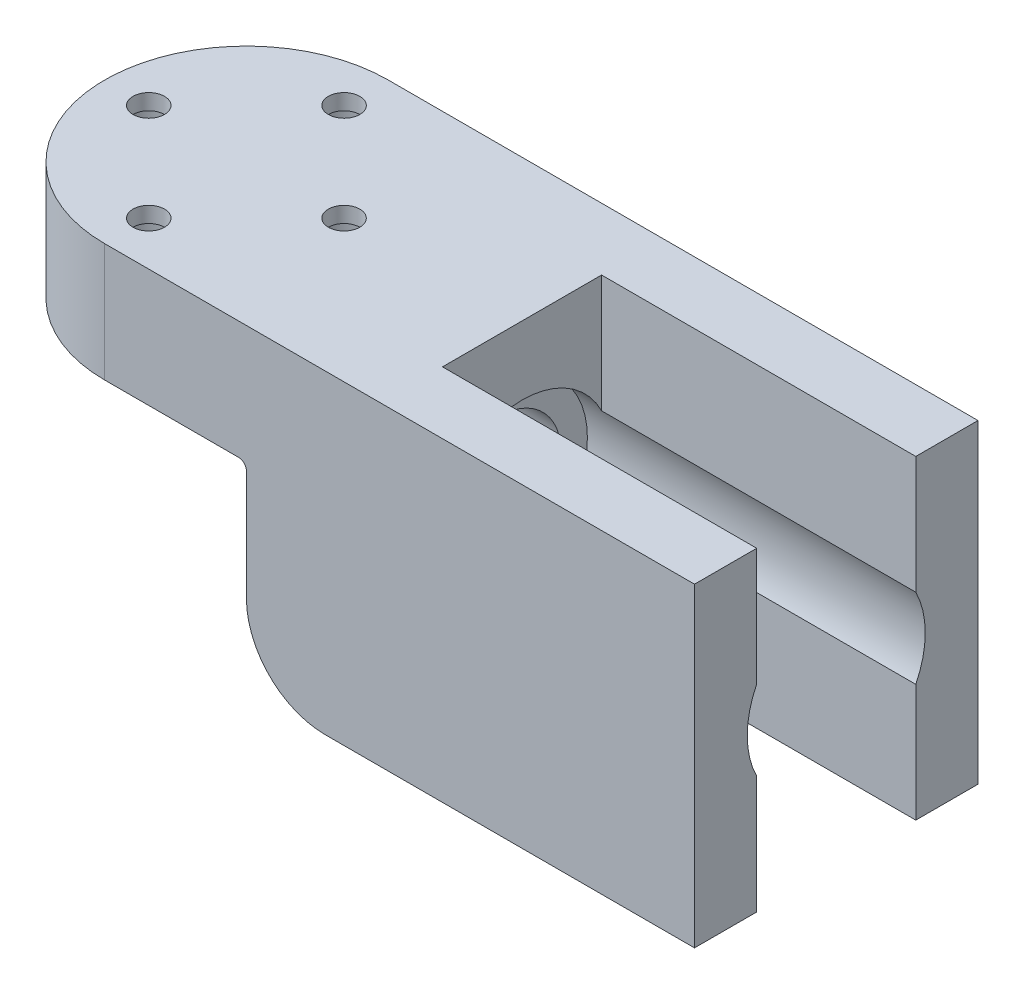
ISO-10303-21;
HEADER;
FILE_DESCRIPTION(('STEP AP214'),'2;1');
FILE_NAME('part.step','',(''),(''),'','','');
FILE_SCHEMA(('AUTOMOTIVE_DESIGN { 1 0 10303 214 1 1 1 1 }'));
ENDSEC;
DATA;
#1=APPLICATION_CONTEXT('core data for automotive mechanical design processes');
#2=APPLICATION_PROTOCOL_DEFINITION('international standard','automotive_design',2000,#1);
#3=PRODUCT_CONTEXT('',#1,'mechanical');
#4=PRODUCT('Part','Part','',(#3));
#5=PRODUCT_RELATED_PRODUCT_CATEGORY('part','',(#4));
#6=PRODUCT_DEFINITION_FORMATION('','',#4);
#7=PRODUCT_DEFINITION_CONTEXT('part definition',#1,'design');
#8=PRODUCT_DEFINITION('design','',#6,#7);
#9=PRODUCT_DEFINITION_SHAPE('','',#8);
#10=(LENGTH_UNIT() NAMED_UNIT(*) SI_UNIT(.MILLI.,.METRE.));
#11=(NAMED_UNIT(*) PLANE_ANGLE_UNIT() SI_UNIT($,.RADIAN.));
#12=(NAMED_UNIT(*) SI_UNIT($,.STERADIAN.) SOLID_ANGLE_UNIT());
#13=UNCERTAINTY_MEASURE_WITH_UNIT(LENGTH_MEASURE(1.E-05),#10,'distance_accuracy_value','');
#14=(GEOMETRIC_REPRESENTATION_CONTEXT(3) GLOBAL_UNCERTAINTY_ASSIGNED_CONTEXT((#13)) GLOBAL_UNIT_ASSIGNED_CONTEXT((#10,
#11,#12)) REPRESENTATION_CONTEXT('',''));
#15=CARTESIAN_POINT('',(0.,0.,0.));
#16=DIRECTION('',(0.,0.,1.));
#17=DIRECTION('',(1.,0.,0.));
#18=AXIS2_PLACEMENT_3D('',#15,#16,#17);
#19=CARTESIAN_POINT('',(0.,20.,0.));
#20=DIRECTION('',(0.,-1.,0.));
#21=DIRECTION('',(0.,0.,-1.));
#22=AXIS2_PLACEMENT_3D('',#19,#20,#21);
#23=CYLINDRICAL_SURFACE('',#22,9.);
#24=CARTESIAN_POINT('',(0.,12.5,0.));
#25=DIRECTION('',(0.,-1.,0.));
#26=DIRECTION('',(0.,0.,-1.));
#27=AXIS2_PLACEMENT_3D('',#24,#25,#26);
#28=CIRCLE('',#27,9.);
#29=CARTESIAN_POINT('',(0.,12.5,9.));
#30=VERTEX_POINT('',#29);
#31=CARTESIAN_POINT('',(0.,12.5,-9.));
#32=VERTEX_POINT('',#31);
#33=EDGE_CURVE('E171',#30,#32,#28,.T.);
#34=ORIENTED_EDGE('',*,*,#33,.F.);
#35=DIRECTION('',(0.,-1.,0.));
#36=VECTOR('',#35,1.);
#37=CARTESIAN_POINT('',(0.,20.,9.));
#38=LINE('',#37,#36);
#39=CARTESIAN_POINT('',(0.,20.,9.));
#40=VERTEX_POINT('',#39);
#41=EDGE_CURVE('E180',#40,#30,#38,.T.);
#42=ORIENTED_EDGE('',*,*,#41,.F.);
#43=CARTESIAN_POINT('',(0.,20.,0.));
#44=DIRECTION('',(0.,1.,0.));
#45=DIRECTION('',(0.,0.,1.));
#46=AXIS2_PLACEMENT_3D('',#43,#44,#45);
#47=CIRCLE('',#46,9.);
#48=CARTESIAN_POINT('',(0.,20.,-9.));
#49=VERTEX_POINT('',#48);
#50=EDGE_CURVE('E236',#49,#40,#47,.T.);
#51=ORIENTED_EDGE('',*,*,#50,.F.);
#52=DIRECTION('',(0.,-1.,0.));
#53=VECTOR('',#52,1.);
#54=CARTESIAN_POINT('',(0.,20.,-9.));
#55=LINE('',#54,#53);
#56=EDGE_CURVE('E183',#49,#32,#55,.T.);
#57=ORIENTED_EDGE('',*,*,#56,.T.);
#58=EDGE_LOOP('',(#34,#42,#51,#57));
#59=FACE_BOUND('',#58,.T.);
#60=ADVANCED_FACE('F35',(#59),#23,.T.);
#61=CARTESIAN_POINT('',(0.,25.5154328932551,6.2));
#62=DIRECTION('',(0.,-1.,0.));
#63=DIRECTION('',(0.,0.,-1.));
#64=AXIS2_PLACEMENT_3D('',#61,#62,#63);
#65=CYLINDRICAL_SURFACE('',#64,1.95);
#66=CARTESIAN_POINT('',(0.,19.,6.2));
#67=DIRECTION('',(0.,1.,0.));
#68=DIRECTION('',(0.,0.,1.));
#69=AXIS2_PLACEMENT_3D('',#66,#67,#68);
#70=CIRCLE('',#69,1.95);
#71=CARTESIAN_POINT('',(0.,19.,8.15));
#72=VERTEX_POINT('',#71);
#73=EDGE_CURVE('E227',#72,#72,#70,.F.);
#74=ORIENTED_EDGE('',*,*,#73,.F.);
#75=EDGE_LOOP('',(#74));
#76=FACE_BOUND('',#75,.T.);
#77=CARTESIAN_POINT('',(0.,12.5,6.2));
#78=DIRECTION('',(0.,-1.,0.));
#79=DIRECTION('',(0.,0.,-1.));
#80=AXIS2_PLACEMENT_3D('',#77,#78,#79);
#81=CIRCLE('',#80,1.95);
#82=CARTESIAN_POINT('',(0.,12.5,4.25));
#83=VERTEX_POINT('',#82);
#84=EDGE_CURVE('E684',#83,#83,#81,.F.);
#85=ORIENTED_EDGE('',*,*,#84,.F.);
#86=EDGE_LOOP('',(#85));
#87=FACE_BOUND('',#86,.T.);
#88=ADVANCED_FACE('F301',(#76,#87),#65,.F.);
#89=CARTESIAN_POINT('',(0.,25.5154328932551,-6.2));
#90=DIRECTION('',(0.,-1.,0.));
#91=DIRECTION('',(0.,0.,-1.));
#92=AXIS2_PLACEMENT_3D('',#89,#90,#91);
#93=CYLINDRICAL_SURFACE('',#92,1.95);
#94=CARTESIAN_POINT('',(0.,19.,-6.2));
#95=DIRECTION('',(0.,1.,0.));
#96=DIRECTION('',(0.,0.,1.));
#97=AXIS2_PLACEMENT_3D('',#94,#95,#96);
#98=CIRCLE('',#97,1.95);
#99=CARTESIAN_POINT('',(0.,19.,-4.25));
#100=VERTEX_POINT('',#99);
#101=EDGE_CURVE('E231',#100,#100,#98,.F.);
#102=ORIENTED_EDGE('',*,*,#101,.F.);
#103=EDGE_LOOP('',(#102));
#104=FACE_BOUND('',#103,.T.);
#105=CARTESIAN_POINT('',(0.,12.5,-6.2));
#106=DIRECTION('',(0.,-1.,0.));
#107=DIRECTION('',(0.,0.,-1.));
#108=AXIS2_PLACEMENT_3D('',#105,#106,#107);
#109=CIRCLE('',#108,1.95);
#110=CARTESIAN_POINT('',(0.,12.5,-8.15));
#111=VERTEX_POINT('',#110);
#112=EDGE_CURVE('E687',#111,#111,#109,.F.);
#113=ORIENTED_EDGE('',*,*,#112,.F.);
#114=EDGE_LOOP('',(#113));
#115=FACE_BOUND('',#114,.T.);
#116=ADVANCED_FACE('F318',(#104,#115),#93,.F.);
#117=CARTESIAN_POINT('',(-6.2,25.5154328932551,0.));
#118=DIRECTION('',(0.,-1.,0.));
#119=DIRECTION('',(0.,0.,-1.));
#120=AXIS2_PLACEMENT_3D('',#117,#118,#119);
#121=CYLINDRICAL_SURFACE('',#120,1.95);
#122=CARTESIAN_POINT('',(-6.2,19.,0.));
#123=DIRECTION('',(0.,1.,0.));
#124=DIRECTION('',(0.,0.,1.));
#125=AXIS2_PLACEMENT_3D('',#122,#123,#124);
#126=CIRCLE('',#125,1.95);
#127=CARTESIAN_POINT('',(-6.2,19.,1.95));
#128=VERTEX_POINT('',#127);
#129=EDGE_CURVE('E228',#128,#128,#126,.F.);
#130=ORIENTED_EDGE('',*,*,#129,.F.);
#131=EDGE_LOOP('',(#130));
#132=FACE_BOUND('',#131,.T.);
#133=CARTESIAN_POINT('',(-6.2,12.5,0.));
#134=DIRECTION('',(0.,-1.,0.));
#135=DIRECTION('',(0.,0.,-1.));
#136=AXIS2_PLACEMENT_3D('',#133,#134,#135);
#137=CIRCLE('',#136,1.95);
#138=CARTESIAN_POINT('',(-6.2,12.5,-1.95));
#139=VERTEX_POINT('',#138);
#140=EDGE_CURVE('E690',#139,#139,#137,.F.);
#141=ORIENTED_EDGE('',*,*,#140,.F.);
#142=EDGE_LOOP('',(#141));
#143=FACE_BOUND('',#142,.T.);
#144=ADVANCED_FACE('F326',(#132,#143),#121,.F.);
#145=CARTESIAN_POINT('',(6.2,25.5154328932551,0.));
#146=DIRECTION('',(0.,-1.,0.));
#147=DIRECTION('',(0.,0.,-1.));
#148=AXIS2_PLACEMENT_3D('',#145,#146,#147);
#149=CYLINDRICAL_SURFACE('',#148,1.95);
#150=CARTESIAN_POINT('',(6.2,19.,0.));
#151=DIRECTION('',(0.,1.,0.));
#152=DIRECTION('',(0.,0.,1.));
#153=AXIS2_PLACEMENT_3D('',#150,#151,#152);
#154=CIRCLE('',#153,1.95);
#155=CARTESIAN_POINT('',(6.2,19.,1.95));
#156=VERTEX_POINT('',#155);
#157=EDGE_CURVE('E224',#156,#156,#154,.F.);
#158=ORIENTED_EDGE('',*,*,#157,.F.);
#159=EDGE_LOOP('',(#158));
#160=FACE_BOUND('',#159,.T.);
#161=CARTESIAN_POINT('',(6.2,12.5,0.));
#162=DIRECTION('',(0.,-1.,0.));
#163=DIRECTION('',(0.,0.,-1.));
#164=AXIS2_PLACEMENT_3D('',#161,#162,#163);
#165=CIRCLE('',#164,1.95);
#166=CARTESIAN_POINT('',(6.2,12.5,-1.95));
#167=VERTEX_POINT('',#166);
#168=EDGE_CURVE('E693',#167,#167,#165,.F.);
#169=ORIENTED_EDGE('',*,*,#168,.F.);
#170=EDGE_LOOP('',(#169));
#171=FACE_BOUND('',#170,.T.);
#172=ADVANCED_FACE('F334',(#160,#171),#149,.F.);
#173=CARTESIAN_POINT('',(17.5,20.,-5.05000000000001));
#174=DIRECTION('',(-1.,0.,0.));
#175=DIRECTION('',(0.,0.,1.));
#176=AXIS2_PLACEMENT_3D('',#173,#174,#175);
#177=PLANE('',#176);
#178=CARTESIAN_POINT('',(17.5,10.,0.));
#179=DIRECTION('',(-1.,0.,0.));
#180=DIRECTION('',(0.,0.,1.));
#181=AXIS2_PLACEMENT_3D('',#178,#179,#180);
#182=CIRCLE('',#181,5.65);
#183=CARTESIAN_POINT('',(17.5,7.46622810813604,5.05000000000001));
#184=VERTEX_POINT('',#183);
#185=CARTESIAN_POINT('',(17.5,7.46622810813602,-5.05000000000001));
#186=VERTEX_POINT('',#185);
#187=EDGE_CURVE('E677',#184,#186,#182,.F.);
#188=ORIENTED_EDGE('',*,*,#187,.F.);
#189=DIRECTION('',(0.,-1.,0.));
#190=VECTOR('',#189,1.);
#191=CARTESIAN_POINT('',(17.5,20.,5.05));
#192=LINE('',#191,#190);
#193=CARTESIAN_POINT('',(17.5,0.,5.05));
#194=VERTEX_POINT('',#193);
#195=EDGE_CURVE('E627',#184,#194,#192,.T.);
#196=ORIENTED_EDGE('',*,*,#195,.T.);
#197=DIRECTION('',(0.,0.,-1.));
#198=VECTOR('',#197,1.);
#199=CARTESIAN_POINT('',(17.5,0.,-5.05000000000001));
#200=LINE('',#199,#198);
#201=CARTESIAN_POINT('',(17.5,0.,-5.05000000000001));
#202=VERTEX_POINT('',#201);
#203=EDGE_CURVE('E655',#194,#202,#200,.T.);
#204=ORIENTED_EDGE('',*,*,#203,.T.);
#205=DIRECTION('',(0.,-1.,0.));
#206=VECTOR('',#205,1.);
#207=CARTESIAN_POINT('',(17.5,20.,-5.05000000000001));
#208=LINE('',#207,#206);
#209=EDGE_CURVE('E205',#186,#202,#208,.T.);
#210=ORIENTED_EDGE('',*,*,#209,.F.);
#211=EDGE_LOOP('',(#188,#196,#204,#210));
#212=FACE_BOUND('',#211,.T.);
#213=ADVANCED_FACE('F342',(#212),#177,.F.);
#214=CARTESIAN_POINT('',(17.5,20.,-5.05000000000001));
#215=DIRECTION('',(0.,0.,-1.));
#216=DIRECTION('',(-1.,0.,0.));
#217=AXIS2_PLACEMENT_3D('',#214,#215,#216);
#218=PLANE('',#217);
#219=DIRECTION('',(-1.,0.,0.));
#220=VECTOR('',#219,1.);
#221=CARTESIAN_POINT('',(37.4496644219723,7.46622810813599,-5.05));
#222=LINE('',#221,#220);
#223=CARTESIAN_POINT('',(37.4496644219723,7.46622810813599,-5.05));
#224=VERTEX_POINT('',#223);
#225=EDGE_CURVE('E675',#186,#224,#222,.F.);
#226=ORIENTED_EDGE('',*,*,#225,.F.);
#227=ORIENTED_EDGE('',*,*,#209,.T.);
#228=DIRECTION('',(1.,0.,0.));
#229=VECTOR('',#228,1.);
#230=CARTESIAN_POINT('',(17.5,0.,-5.05000000000001));
#231=LINE('',#230,#229);
#232=CARTESIAN_POINT('',(37.4496644219723,0.,-5.05));
#233=VERTEX_POINT('',#232);
#234=EDGE_CURVE('E652',#202,#233,#231,.T.);
#235=ORIENTED_EDGE('',*,*,#234,.T.);
#236=DIRECTION('',(0.,-1.,0.));
#237=VECTOR('',#236,1.);
#238=CARTESIAN_POINT('',(37.4496644219723,20.,-5.05));
#239=LINE('',#238,#237);
#240=EDGE_CURVE('E201',#224,#233,#239,.T.);
#241=ORIENTED_EDGE('',*,*,#240,.F.);
#242=EDGE_LOOP('',(#226,#227,#235,#241));
#243=FACE_BOUND('',#242,.T.);
#244=ADVANCED_FACE('F364',(#243),#218,.F.);
#245=DIRECTION('',(-1.,0.,0.));
#246=VECTOR('',#245,1.);
#247=CARTESIAN_POINT('',(37.4496644219723,12.533771891864,-5.05));
#248=LINE('',#247,#246);
#249=CARTESIAN_POINT('',(37.4496644219723,12.533771891864,-5.05));
#250=VERTEX_POINT('',#249);
#251=CARTESIAN_POINT('',(17.5,12.533771891864,-5.05000000000001));
#252=VERTEX_POINT('',#251);
#253=EDGE_CURVE('E658',#250,#252,#248,.T.);
#254=ORIENTED_EDGE('',*,*,#253,.F.);
#255=CARTESIAN_POINT('',(37.4496644219723,20.,-5.05));
#256=VERTEX_POINT('',#255);
#257=EDGE_CURVE('E202',#256,#250,#239,.T.);
#258=ORIENTED_EDGE('',*,*,#257,.F.);
#259=DIRECTION('',(1.,0.,0.));
#260=VECTOR('',#259,1.);
#261=CARTESIAN_POINT('',(17.5,20.,-5.05000000000001));
#262=LINE('',#261,#260);
#263=CARTESIAN_POINT('',(17.5,20.,-5.05000000000001));
#264=VERTEX_POINT('',#263);
#265=EDGE_CURVE('E669',#264,#256,#262,.T.);
#266=ORIENTED_EDGE('',*,*,#265,.F.);
#267=EDGE_CURVE('E206',#264,#252,#208,.T.);
#268=ORIENTED_EDGE('',*,*,#267,.T.);
#269=EDGE_LOOP('',(#254,#258,#266,#268));
#270=FACE_BOUND('',#269,.T.);
#271=ADVANCED_FACE('F367',(#270),#218,.F.);
#272=CARTESIAN_POINT('',(17.5,20.,5.05));
#273=DIRECTION('',(0.,0.,1.));
#274=DIRECTION('',(1.,0.,0.));
#275=AXIS2_PLACEMENT_3D('',#272,#273,#274);
#276=PLANE('',#275);
#277=DIRECTION('',(-1.,0.,0.));
#278=VECTOR('',#277,1.);
#279=CARTESIAN_POINT('',(37.4496644219723,12.533771891864,5.05));
#280=LINE('',#279,#278);
#281=CARTESIAN_POINT('',(17.5,12.533771891864,5.05000000000001));
#282=VERTEX_POINT('',#281);
#283=CARTESIAN_POINT('',(37.4496644219723,12.533771891864,5.05));
#284=VERTEX_POINT('',#283);
#285=EDGE_CURVE('E249',#282,#284,#280,.F.);
#286=ORIENTED_EDGE('',*,*,#285,.F.);
#287=CARTESIAN_POINT('',(17.5,20.,5.05));
#288=VERTEX_POINT('',#287);
#289=EDGE_CURVE('E637',#288,#282,#192,.T.);
#290=ORIENTED_EDGE('',*,*,#289,.F.);
#291=DIRECTION('',(-1.,0.,0.));
#292=VECTOR('',#291,1.);
#293=CARTESIAN_POINT('',(17.5,20.,5.05));
#294=LINE('',#293,#292);
#295=CARTESIAN_POINT('',(37.4496644219723,20.,5.05));
#296=VERTEX_POINT('',#295);
#297=EDGE_CURVE('E659',#296,#288,#294,.T.);
#298=ORIENTED_EDGE('',*,*,#297,.F.);
#299=DIRECTION('',(0.,-1.,0.));
#300=VECTOR('',#299,1.);
#301=CARTESIAN_POINT('',(37.4496644219723,20.,5.05));
#302=LINE('',#301,#300);
#303=EDGE_CURVE('E195',#296,#284,#302,.T.);
#304=ORIENTED_EDGE('',*,*,#303,.T.);
#305=EDGE_LOOP('',(#286,#290,#298,#304));
#306=FACE_BOUND('',#305,.T.);
#307=ADVANCED_FACE('F383',(#306),#276,.F.);
#308=DIRECTION('',(-1.,0.,0.));
#309=VECTOR('',#308,1.);
#310=CARTESIAN_POINT('',(37.4496644219723,7.46622810813604,5.05));
#311=LINE('',#310,#309);
#312=CARTESIAN_POINT('',(37.4496644219723,7.46622810813604,5.05));
#313=VERTEX_POINT('',#312);
#314=EDGE_CURVE('E238',#313,#184,#311,.T.);
#315=ORIENTED_EDGE('',*,*,#314,.F.);
#316=CARTESIAN_POINT('',(37.4496644219723,0.,5.05));
#317=VERTEX_POINT('',#316);
#318=EDGE_CURVE('E625',#313,#317,#302,.T.);
#319=ORIENTED_EDGE('',*,*,#318,.T.);
#320=DIRECTION('',(-1.,0.,0.));
#321=VECTOR('',#320,1.);
#322=CARTESIAN_POINT('',(17.5,0.,5.05));
#323=LINE('',#322,#321);
#324=EDGE_CURVE('E641',#317,#194,#323,.T.);
#325=ORIENTED_EDGE('',*,*,#324,.T.);
#326=ORIENTED_EDGE('',*,*,#195,.F.);
#327=EDGE_LOOP('',(#315,#319,#325,#326));
#328=FACE_BOUND('',#327,.T.);
#329=ADVANCED_FACE('F310',(#328),#276,.F.);
#330=CARTESIAN_POINT('',(0.,20.,0.));
#331=DIRECTION('',(0.,1.,0.));
#332=DIRECTION('',(0.,0.,1.));
#333=AXIS2_PLACEMENT_3D('',#330,#331,#332);
#334=PLANE('',#333);
#335=CARTESIAN_POINT('',(0.,20.,6.2));
#336=DIRECTION('',(0.,-1.,0.));
#337=DIRECTION('',(0.,0.,-1.));
#338=AXIS2_PLACEMENT_3D('',#335,#336,#337);
#339=CIRCLE('',#338,1.);
#340=CARTESIAN_POINT('',(0.,20.,5.2));
#341=VERTEX_POINT('',#340);
#342=EDGE_CURVE('E210',#341,#341,#339,.T.);
#343=ORIENTED_EDGE('',*,*,#342,.T.);
#344=EDGE_LOOP('',(#343));
#345=FACE_BOUND('',#344,.T.);
#346=CARTESIAN_POINT('',(0.,20.,-6.2));
#347=DIRECTION('',(0.,-1.,0.));
#348=DIRECTION('',(0.,0.,-1.));
#349=AXIS2_PLACEMENT_3D('',#346,#347,#348);
#350=CIRCLE('',#349,1.);
#351=CARTESIAN_POINT('',(0.,20.,-7.2));
#352=VERTEX_POINT('',#351);
#353=EDGE_CURVE('E214',#352,#352,#350,.T.);
#354=ORIENTED_EDGE('',*,*,#353,.T.);
#355=EDGE_LOOP('',(#354));
#356=FACE_BOUND('',#355,.T.);
#357=CARTESIAN_POINT('',(-6.2,20.,0.));
#358=DIRECTION('',(0.,-1.,0.));
#359=DIRECTION('',(0.,0.,-1.));
#360=AXIS2_PLACEMENT_3D('',#357,#358,#359);
#361=CIRCLE('',#360,1.);
#362=CARTESIAN_POINT('',(-6.2,20.,-1.));
#363=VERTEX_POINT('',#362);
#364=EDGE_CURVE('E209',#363,#363,#361,.T.);
#365=ORIENTED_EDGE('',*,*,#364,.T.);
#366=EDGE_LOOP('',(#365));
#367=FACE_BOUND('',#366,.T.);
#368=CARTESIAN_POINT('',(6.2,20.,0.));
#369=DIRECTION('',(0.,-1.,0.));
#370=DIRECTION('',(0.,0.,-1.));
#371=AXIS2_PLACEMENT_3D('',#368,#369,#370);
#372=CIRCLE('',#371,1.);
#373=CARTESIAN_POINT('',(6.2,20.,-1.));
#374=VERTEX_POINT('',#373);
#375=EDGE_CURVE('E219',#374,#374,#372,.T.);
#376=ORIENTED_EDGE('',*,*,#375,.T.);
#377=EDGE_LOOP('',(#376));
#378=FACE_BOUND('',#377,.T.);
#379=ORIENTED_EDGE('',*,*,#50,.T.);
#380=DIRECTION('',(1.,0.,0.));
#381=VECTOR('',#380,1.);
#382=CARTESIAN_POINT('',(0.,20.,9.));
#383=LINE('',#382,#381);
#384=CARTESIAN_POINT('',(37.4496644219723,20.,9.));
#385=VERTEX_POINT('',#384);
#386=EDGE_CURVE('E189',#40,#385,#383,.T.);
#387=ORIENTED_EDGE('',*,*,#386,.T.);
#388=DIRECTION('',(0.,0.,-1.));
#389=VECTOR('',#388,1.);
#390=CARTESIAN_POINT('',(37.4496644219723,20.,9.));
#391=LINE('',#390,#389);
#392=EDGE_CURVE('E661',#385,#296,#391,.T.);
#393=ORIENTED_EDGE('',*,*,#392,.T.);
#394=ORIENTED_EDGE('',*,*,#297,.T.);
#395=DIRECTION('',(0.,0.,-1.));
#396=VECTOR('',#395,1.);
#397=CARTESIAN_POINT('',(17.5,20.,-5.05000000000001));
#398=LINE('',#397,#396);
#399=EDGE_CURVE('E643',#288,#264,#398,.T.);
#400=ORIENTED_EDGE('',*,*,#399,.T.);
#401=ORIENTED_EDGE('',*,*,#265,.T.);
#402=DIRECTION('',(0.,0.,-1.));
#403=VECTOR('',#402,1.);
#404=CARTESIAN_POINT('',(37.4496644219723,20.,-9.));
#405=LINE('',#404,#403);
#406=CARTESIAN_POINT('',(37.4496644219723,20.,-9.));
#407=VERTEX_POINT('',#406);
#408=EDGE_CURVE('E667',#256,#407,#405,.T.);
#409=ORIENTED_EDGE('',*,*,#408,.T.);
#410=DIRECTION('',(-1.,0.,0.));
#411=VECTOR('',#410,1.);
#412=CARTESIAN_POINT('',(0.,20.,-9.));
#413=LINE('',#412,#411);
#414=EDGE_CURVE('E664',#407,#49,#413,.T.);
#415=ORIENTED_EDGE('',*,*,#414,.T.);
#416=EDGE_LOOP('',(#379,#387,#393,#394,#400,#401,#409,#415));
#417=FACE_BOUND('',#416,.T.);
#418=ADVANCED_FACE('F306',(#345,#356,#367,#378,#417),#334,.T.);
#419=CARTESIAN_POINT('',(0.,0.,0.));
#420=DIRECTION('',(0.,1.,0.));
#421=DIRECTION('',(0.,0.,1.));
#422=AXIS2_PLACEMENT_3D('',#419,#420,#421);
#423=PLANE('',#422);
#424=DIRECTION('',(1.,0.,0.));
#425=VECTOR('',#424,1.);
#426=CARTESIAN_POINT('',(0.,0.,9.));
#427=LINE('',#426,#425);
#428=CARTESIAN_POINT('',(14.,0.,9.));
#429=VERTEX_POINT('',#428);
#430=CARTESIAN_POINT('',(37.4496644219723,0.,9.));
#431=VERTEX_POINT('',#430);
#432=EDGE_CURVE('E645',#429,#431,#427,.T.);
#433=ORIENTED_EDGE('',*,*,#432,.F.);
#434=DIRECTION('',(0.,0.,1.));
#435=VECTOR('',#434,1.);
#436=CARTESIAN_POINT('',(14.,0.,0.));
#437=LINE('',#436,#435);
#438=CARTESIAN_POINT('',(14.,0.,-9.));
#439=VERTEX_POINT('',#438);
#440=EDGE_CURVE('E256',#429,#439,#437,.F.);
#441=ORIENTED_EDGE('',*,*,#440,.T.);
#442=DIRECTION('',(-1.,0.,0.));
#443=VECTOR('',#442,1.);
#444=CARTESIAN_POINT('',(0.,0.,-9.));
#445=LINE('',#444,#443);
#446=CARTESIAN_POINT('',(37.4496644219723,0.,-9.));
#447=VERTEX_POINT('',#446);
#448=EDGE_CURVE('E647',#447,#439,#445,.T.);
#449=ORIENTED_EDGE('',*,*,#448,.F.);
#450=DIRECTION('',(0.,0.,-1.));
#451=VECTOR('',#450,1.);
#452=CARTESIAN_POINT('',(37.4496644219723,0.,-9.));
#453=LINE('',#452,#451);
#454=EDGE_CURVE('E650',#233,#447,#453,.T.);
#455=ORIENTED_EDGE('',*,*,#454,.F.);
#456=ORIENTED_EDGE('',*,*,#234,.F.);
#457=ORIENTED_EDGE('',*,*,#203,.F.);
#458=ORIENTED_EDGE('',*,*,#324,.F.);
#459=DIRECTION('',(0.,0.,-1.));
#460=VECTOR('',#459,1.);
#461=CARTESIAN_POINT('',(37.4496644219723,0.,9.));
#462=LINE('',#461,#460);
#463=EDGE_CURVE('E635',#431,#317,#462,.T.);
#464=ORIENTED_EDGE('',*,*,#463,.F.);
#465=EDGE_LOOP('',(#433,#441,#449,#455,#456,#457,#458,#464));
#466=FACE_BOUND('',#465,.T.);
#467=ADVANCED_FACE('F302',(#466),#423,.F.);
#468=CARTESIAN_POINT('',(0.,19.,0.));
#469=DIRECTION('',(0.,1.,0.));
#470=DIRECTION('',(0.,0.,1.));
#471=AXIS2_PLACEMENT_3D('',#468,#469,#470);
#472=PLANE('',#471);
#473=CARTESIAN_POINT('',(0.,19.,6.2));
#474=DIRECTION('',(0.,1.,0.));
#475=DIRECTION('',(0.,0.,1.));
#476=AXIS2_PLACEMENT_3D('',#473,#474,#475);
#477=CIRCLE('',#476,1.);
#478=CARTESIAN_POINT('',(0.,19.,7.2));
#479=VERTEX_POINT('',#478);
#480=EDGE_CURVE('E223',#479,#479,#477,.T.);
#481=ORIENTED_EDGE('',*,*,#480,.T.);
#482=EDGE_LOOP('',(#481));
#483=FACE_BOUND('',#482,.T.);
#484=ORIENTED_EDGE('',*,*,#73,.T.);
#485=EDGE_LOOP('',(#484));
#486=FACE_BOUND('',#485,.T.);
#487=ADVANCED_FACE('F305',(#483,#486),#472,.F.);
#488=CARTESIAN_POINT('',(0.,19.,0.));
#489=DIRECTION('',(0.,1.,0.));
#490=DIRECTION('',(0.,0.,1.));
#491=AXIS2_PLACEMENT_3D('',#488,#489,#490);
#492=PLANE('',#491);
#493=CARTESIAN_POINT('',(0.,19.,-6.2));
#494=DIRECTION('',(0.,1.,0.));
#495=DIRECTION('',(0.,0.,1.));
#496=AXIS2_PLACEMENT_3D('',#493,#494,#495);
#497=CIRCLE('',#496,1.);
#498=CARTESIAN_POINT('',(0.,19.,-5.2));
#499=VERTEX_POINT('',#498);
#500=EDGE_CURVE('E243',#499,#499,#497,.T.);
#501=ORIENTED_EDGE('',*,*,#500,.T.);
#502=EDGE_LOOP('',(#501));
#503=FACE_BOUND('',#502,.T.);
#504=ORIENTED_EDGE('',*,*,#101,.T.);
#505=EDGE_LOOP('',(#504));
#506=FACE_BOUND('',#505,.T.);
#507=ADVANCED_FACE('F314',(#503,#506),#492,.F.);
#508=CARTESIAN_POINT('',(0.,19.,0.));
#509=DIRECTION('',(0.,1.,0.));
#510=DIRECTION('',(0.,0.,1.));
#511=AXIS2_PLACEMENT_3D('',#508,#509,#510);
#512=PLANE('',#511);
#513=CARTESIAN_POINT('',(-6.2,19.,0.));
#514=DIRECTION('',(0.,1.,0.));
#515=DIRECTION('',(0.,0.,1.));
#516=AXIS2_PLACEMENT_3D('',#513,#514,#515);
#517=CIRCLE('',#516,1.);
#518=CARTESIAN_POINT('',(-6.2,19.,0.999999999999999));
#519=VERTEX_POINT('',#518);
#520=EDGE_CURVE('E213',#519,#519,#517,.T.);
#521=ORIENTED_EDGE('',*,*,#520,.T.);
#522=EDGE_LOOP('',(#521));
#523=FACE_BOUND('',#522,.T.);
#524=ORIENTED_EDGE('',*,*,#129,.T.);
#525=EDGE_LOOP('',(#524));
#526=FACE_BOUND('',#525,.T.);
#527=ADVANCED_FACE('F322',(#523,#526),#512,.F.);
#528=CARTESIAN_POINT('',(0.,19.,0.));
#529=DIRECTION('',(0.,1.,0.));
#530=DIRECTION('',(0.,0.,1.));
#531=AXIS2_PLACEMENT_3D('',#528,#529,#530);
#532=PLANE('',#531);
#533=CARTESIAN_POINT('',(6.2,19.,0.));
#534=DIRECTION('',(0.,1.,0.));
#535=DIRECTION('',(0.,0.,1.));
#536=AXIS2_PLACEMENT_3D('',#533,#534,#535);
#537=CIRCLE('',#536,1.);
#538=CARTESIAN_POINT('',(6.2,19.,1.));
#539=VERTEX_POINT('',#538);
#540=EDGE_CURVE('E222',#539,#539,#537,.T.);
#541=ORIENTED_EDGE('',*,*,#540,.T.);
#542=EDGE_LOOP('',(#541));
#543=FACE_BOUND('',#542,.T.);
#544=ORIENTED_EDGE('',*,*,#157,.T.);
#545=EDGE_LOOP('',(#544));
#546=FACE_BOUND('',#545,.T.);
#547=ADVANCED_FACE('F330',(#543,#546),#532,.F.);
#548=CARTESIAN_POINT('',(6.2,20.,0.));
#549=DIRECTION('',(0.,-1.,0.));
#550=DIRECTION('',(0.,0.,-1.));
#551=AXIS2_PLACEMENT_3D('',#548,#549,#550);
#552=CYLINDRICAL_SURFACE('',#551,1.);
#553=ORIENTED_EDGE('',*,*,#375,.F.);
#554=EDGE_LOOP('',(#553));
#555=FACE_BOUND('',#554,.T.);
#556=ORIENTED_EDGE('',*,*,#540,.F.);
#557=EDGE_LOOP('',(#556));
#558=FACE_BOUND('',#557,.T.);
#559=ADVANCED_FACE('F338',(#555,#558),#552,.F.);
#560=CARTESIAN_POINT('',(-6.2,20.,0.));
#561=DIRECTION('',(0.,-1.,0.));
#562=DIRECTION('',(0.,0.,-1.));
#563=AXIS2_PLACEMENT_3D('',#560,#561,#562);
#564=CYLINDRICAL_SURFACE('',#563,1.);
#565=ORIENTED_EDGE('',*,*,#364,.F.);
#566=EDGE_LOOP('',(#565));
#567=FACE_BOUND('',#566,.T.);
#568=ORIENTED_EDGE('',*,*,#520,.F.);
#569=EDGE_LOOP('',(#568));
#570=FACE_BOUND('',#569,.T.);
#571=ADVANCED_FACE('F346',(#567,#570),#564,.F.);
#572=CARTESIAN_POINT('',(0.,20.,-6.2));
#573=DIRECTION('',(0.,-1.,0.));
#574=DIRECTION('',(0.,0.,-1.));
#575=AXIS2_PLACEMENT_3D('',#572,#573,#574);
#576=CYLINDRICAL_SURFACE('',#575,1.);
#577=ORIENTED_EDGE('',*,*,#353,.F.);
#578=EDGE_LOOP('',(#577));
#579=FACE_BOUND('',#578,.T.);
#580=ORIENTED_EDGE('',*,*,#500,.F.);
#581=EDGE_LOOP('',(#580));
#582=FACE_BOUND('',#581,.T.);
#583=ADVANCED_FACE('F350',(#579,#582),#576,.F.);
#584=CARTESIAN_POINT('',(0.,20.,6.2));
#585=DIRECTION('',(0.,-1.,0.));
#586=DIRECTION('',(0.,0.,-1.));
#587=AXIS2_PLACEMENT_3D('',#584,#585,#586);
#588=CYLINDRICAL_SURFACE('',#587,1.);
#589=ORIENTED_EDGE('',*,*,#342,.F.);
#590=EDGE_LOOP('',(#589));
#591=FACE_BOUND('',#590,.T.);
#592=ORIENTED_EDGE('',*,*,#480,.F.);
#593=EDGE_LOOP('',(#592));
#594=FACE_BOUND('',#593,.T.);
#595=ADVANCED_FACE('F354',(#591,#594),#588,.F.);
#596=EDGE_CURVE('E674',#252,#282,#182,.F.);
#597=ORIENTED_EDGE('',*,*,#596,.F.);
#598=ORIENTED_EDGE('',*,*,#267,.F.);
#599=ORIENTED_EDGE('',*,*,#399,.F.);
#600=ORIENTED_EDGE('',*,*,#289,.T.);
#601=EDGE_LOOP('',(#597,#598,#599,#600));
#602=FACE_BOUND('',#601,.T.);
#603=ADVANCED_FACE('F358',(#602),#177,.F.);
#604=CARTESIAN_POINT('',(37.4496644219723,20.,-9.));
#605=DIRECTION('',(-1.,0.,0.));
#606=DIRECTION('',(0.,0.,1.));
#607=AXIS2_PLACEMENT_3D('',#604,#605,#606);
#608=PLANE('',#607);
#609=CARTESIAN_POINT('',(37.4496644219723,10.,0.));
#610=DIRECTION('',(1.,0.,0.));
#611=DIRECTION('',(0.,0.,-1.));
#612=AXIS2_PLACEMENT_3D('',#609,#610,#611);
#613=CIRCLE('',#612,5.65);
#614=EDGE_CURVE('E679',#224,#250,#613,.T.);
#615=ORIENTED_EDGE('',*,*,#614,.F.);
#616=ORIENTED_EDGE('',*,*,#240,.T.);
#617=ORIENTED_EDGE('',*,*,#454,.T.);
#618=DIRECTION('',(0.,-1.,0.));
#619=VECTOR('',#618,1.);
#620=CARTESIAN_POINT('',(37.4496644219723,20.,-9.));
#621=LINE('',#620,#619);
#622=EDGE_CURVE('E192',#407,#447,#621,.T.);
#623=ORIENTED_EDGE('',*,*,#622,.F.);
#624=ORIENTED_EDGE('',*,*,#408,.F.);
#625=ORIENTED_EDGE('',*,*,#257,.T.);
#626=EDGE_LOOP('',(#615,#616,#617,#623,#624,#625));
#627=FACE_BOUND('',#626,.T.);
#628=ADVANCED_FACE('F362',(#627),#608,.F.);
#629=CARTESIAN_POINT('',(0.,20.,-9.));
#630=DIRECTION('',(0.,0.,1.));
#631=DIRECTION('',(1.,0.,0.));
#632=AXIS2_PLACEMENT_3D('',#629,#630,#631);
#633=PLANE('',#632);
#634=ORIENTED_EDGE('',*,*,#448,.T.);
#635=CARTESIAN_POINT('',(14.,5.,-9.));
#636=DIRECTION('',(0.,0.,1.));
#637=DIRECTION('',(1.,0.,0.));
#638=AXIS2_PLACEMENT_3D('',#635,#636,#637);
#639=CIRCLE('',#638,5.);
#640=CARTESIAN_POINT('',(9.,5.,-9.));
#641=VERTEX_POINT('',#640);
#642=EDGE_CURVE('E258',#439,#641,#639,.F.);
#643=ORIENTED_EDGE('',*,*,#642,.T.);
#644=DIRECTION('',(0.,-1.,0.));
#645=VECTOR('',#644,1.);
#646=CARTESIAN_POINT('',(9.,12.5,-9.));
#647=LINE('',#646,#645);
#648=CARTESIAN_POINT('',(9.,12.,-9.));
#649=VERTEX_POINT('',#648);
#650=EDGE_CURVE('E696',#649,#641,#647,.T.);
#651=ORIENTED_EDGE('',*,*,#650,.F.);
#652=CARTESIAN_POINT('',(8.5,12.,-9.));
#653=DIRECTION('',(0.,0.,1.));
#654=DIRECTION('',(1.,0.,0.));
#655=AXIS2_PLACEMENT_3D('',#652,#653,#654);
#656=CIRCLE('',#655,0.5);
#657=CARTESIAN_POINT('',(8.5,12.5,-9.));
#658=VERTEX_POINT('',#657);
#659=EDGE_CURVE('E12',#649,#658,#656,.T.);
#660=ORIENTED_EDGE('',*,*,#659,.T.);
#661=DIRECTION('',(1.,0.,0.));
#662=VECTOR('',#661,1.);
#663=CARTESIAN_POINT('',(0.,12.5,-9.));
#664=LINE('',#663,#662);
#665=EDGE_CURVE('E184',#32,#658,#664,.T.);
#666=ORIENTED_EDGE('',*,*,#665,.F.);
#667=ORIENTED_EDGE('',*,*,#56,.F.);
#668=ORIENTED_EDGE('',*,*,#414,.F.);
#669=ORIENTED_EDGE('',*,*,#622,.T.);
#670=EDGE_LOOP('',(#634,#643,#651,#660,#666,#667,#668,#669));
#671=FACE_BOUND('',#670,.T.);
#672=ADVANCED_FACE('F371',(#671),#633,.F.);
#673=CARTESIAN_POINT('',(0.,20.,9.));
#674=DIRECTION('',(0.,0.,-1.));
#675=DIRECTION('',(-1.,0.,0.));
#676=AXIS2_PLACEMENT_3D('',#673,#674,#675);
#677=PLANE('',#676);
#678=DIRECTION('',(-1.,0.,0.));
#679=VECTOR('',#678,1.);
#680=CARTESIAN_POINT('',(9.,12.5,9.));
#681=LINE('',#680,#679);
#682=CARTESIAN_POINT('',(8.5,12.5,9.));
#683=VERTEX_POINT('',#682);
#684=EDGE_CURVE('E166',#683,#30,#681,.T.);
#685=ORIENTED_EDGE('',*,*,#684,.F.);
#686=CARTESIAN_POINT('',(8.5,12.,9.));
#687=DIRECTION('',(0.,0.,-1.));
#688=DIRECTION('',(-1.,0.,0.));
#689=AXIS2_PLACEMENT_3D('',#686,#687,#688);
#690=CIRCLE('',#689,0.5);
#691=CARTESIAN_POINT('',(9.,12.,9.));
#692=VERTEX_POINT('',#691);
#693=EDGE_CURVE('E59',#683,#692,#690,.T.);
#694=ORIENTED_EDGE('',*,*,#693,.T.);
#695=DIRECTION('',(0.,-1.,0.));
#696=VECTOR('',#695,1.);
#697=CARTESIAN_POINT('',(9.,12.5,9.));
#698=LINE('',#697,#696);
#699=CARTESIAN_POINT('',(9.,5.,9.));
#700=VERTEX_POINT('',#699);
#701=EDGE_CURVE('E697',#692,#700,#698,.T.);
#702=ORIENTED_EDGE('',*,*,#701,.T.);
#703=CARTESIAN_POINT('',(14.,5.,9.));
#704=DIRECTION('',(0.,0.,-1.));
#705=DIRECTION('',(-1.,0.,0.));
#706=AXIS2_PLACEMENT_3D('',#703,#704,#705);
#707=CIRCLE('',#706,5.);
#708=EDGE_CURVE('E254',#700,#429,#707,.F.);
#709=ORIENTED_EDGE('',*,*,#708,.T.);
#710=ORIENTED_EDGE('',*,*,#432,.T.);
#711=DIRECTION('',(0.,-1.,0.));
#712=VECTOR('',#711,1.);
#713=CARTESIAN_POINT('',(37.4496644219723,20.,9.));
#714=LINE('',#713,#712);
#715=EDGE_CURVE('E190',#385,#431,#714,.T.);
#716=ORIENTED_EDGE('',*,*,#715,.F.);
#717=ORIENTED_EDGE('',*,*,#386,.F.);
#718=ORIENTED_EDGE('',*,*,#41,.T.);
#719=EDGE_LOOP('',(#685,#694,#702,#709,#710,#716,#717,#718));
#720=FACE_BOUND('',#719,.T.);
#721=ADVANCED_FACE('F187',(#720),#677,.F.);
#722=CARTESIAN_POINT('',(37.4496644219723,20.,9.));
#723=DIRECTION('',(-1.,0.,0.));
#724=DIRECTION('',(0.,0.,1.));
#725=AXIS2_PLACEMENT_3D('',#722,#723,#724);
#726=PLANE('',#725);
#727=EDGE_CURVE('E632',#284,#313,#613,.T.);
#728=ORIENTED_EDGE('',*,*,#727,.F.);
#729=ORIENTED_EDGE('',*,*,#303,.F.);
#730=ORIENTED_EDGE('',*,*,#392,.F.);
#731=ORIENTED_EDGE('',*,*,#715,.T.);
#732=ORIENTED_EDGE('',*,*,#463,.T.);
#733=ORIENTED_EDGE('',*,*,#318,.F.);
#734=EDGE_LOOP('',(#728,#729,#730,#731,#732,#733));
#735=FACE_BOUND('',#734,.T.);
#736=ADVANCED_FACE('F378',(#735),#726,.F.);
#737=CARTESIAN_POINT('',(37.4496644219723,10.,0.));
#738=DIRECTION('',(-1.,0.,0.));
#739=DIRECTION('',(0.,0.,1.));
#740=AXIS2_PLACEMENT_3D('',#737,#738,#739);
#741=CYLINDRICAL_SURFACE('',#740,5.65);
#742=CARTESIAN_POINT('',(16.,10.,0.));
#743=DIRECTION('',(1.,0.,0.));
#744=DIRECTION('',(0.,0.,-1.));
#745=AXIS2_PLACEMENT_3D('',#742,#743,#744);
#746=CIRCLE('',#745,5.65);
#747=CARTESIAN_POINT('',(16.,10.,-5.65));
#748=VERTEX_POINT('',#747);
#749=EDGE_CURVE('E681',#748,#748,#746,.T.);
#750=ORIENTED_EDGE('',*,*,#749,.F.);
#751=EDGE_LOOP('',(#750));
#752=FACE_BOUND('',#751,.T.);
#753=ORIENTED_EDGE('',*,*,#253,.T.);
#754=ORIENTED_EDGE('',*,*,#596,.T.);
#755=ORIENTED_EDGE('',*,*,#285,.T.);
#756=ORIENTED_EDGE('',*,*,#727,.T.);
#757=ORIENTED_EDGE('',*,*,#314,.T.);
#758=ORIENTED_EDGE('',*,*,#187,.T.);
#759=ORIENTED_EDGE('',*,*,#225,.T.);
#760=ORIENTED_EDGE('',*,*,#614,.T.);
#761=EDGE_LOOP('',(#753,#754,#755,#756,#757,#758,#759,#760));
#762=FACE_BOUND('',#761,.T.);
#763=ADVANCED_FACE('F381',(#752,#762),#741,.F.);
#764=CARTESIAN_POINT('',(16.,10.,0.));
#765=DIRECTION('',(1.,0.,0.));
#766=DIRECTION('',(0.,0.,-1.));
#767=AXIS2_PLACEMENT_3D('',#764,#765,#766);
#768=PLANE('',#767);
#769=CARTESIAN_POINT('',(16.,10.,0.));
#770=DIRECTION('',(1.,0.,0.));
#771=DIRECTION('',(0.,0.,-1.));
#772=AXIS2_PLACEMENT_3D('',#769,#770,#771);
#773=CIRCLE('',#772,3.99);
#774=CARTESIAN_POINT('',(16.,10.,-3.99000000000001));
#775=VERTEX_POINT('',#774);
#776=EDGE_CURVE('E703',#775,#775,#773,.T.);
#777=ORIENTED_EDGE('',*,*,#776,.F.);
#778=EDGE_LOOP('',(#777));
#779=FACE_BOUND('',#778,.T.);
#780=ORIENTED_EDGE('',*,*,#749,.T.);
#781=EDGE_LOOP('',(#780));
#782=FACE_BOUND('',#781,.T.);
#783=ADVANCED_FACE('F389',(#779,#782),#768,.T.);
#784=CARTESIAN_POINT('',(0.,12.5,0.));
#785=DIRECTION('',(0.,-1.,0.));
#786=DIRECTION('',(0.,0.,-1.));
#787=AXIS2_PLACEMENT_3D('',#784,#785,#786);
#788=PLANE('',#787);
#789=DIRECTION('',(1.,0.,0.));
#790=VECTOR('',#789,1.);
#791=CARTESIAN_POINT('',(9.,12.5,3.10967843996771));
#792=LINE('',#791,#790);
#793=CARTESIAN_POINT('',(9.,12.5,3.10967843996771));
#794=VERTEX_POINT('',#793);
#795=CARTESIAN_POINT('',(8.5,12.5,3.10967843996771));
#796=VERTEX_POINT('',#795);
#797=EDGE_CURVE('E51',#794,#796,#792,.F.);
#798=ORIENTED_EDGE('',*,*,#797,.T.);
#799=DIRECTION('',(0.,0.,1.));
#800=VECTOR('',#799,1.);
#801=CARTESIAN_POINT('',(8.5,12.5,0.));
#802=LINE('',#801,#800);
#803=EDGE_CURVE('E174',#796,#683,#802,.T.);
#804=ORIENTED_EDGE('',*,*,#803,.T.);
#805=ORIENTED_EDGE('',*,*,#684,.T.);
#806=ORIENTED_EDGE('',*,*,#33,.T.);
#807=ORIENTED_EDGE('',*,*,#665,.T.);
#808=DIRECTION('',(0.,0.,1.));
#809=VECTOR('',#808,1.);
#810=CARTESIAN_POINT('',(8.5,12.5,0.));
#811=LINE('',#810,#809);
#812=CARTESIAN_POINT('',(8.5,12.5,-3.10967843996771));
#813=VERTEX_POINT('',#812);
#814=EDGE_CURVE('E266',#658,#813,#811,.T.);
#815=ORIENTED_EDGE('',*,*,#814,.T.);
#816=DIRECTION('',(1.,0.,0.));
#817=VECTOR('',#816,1.);
#818=CARTESIAN_POINT('',(8.5,12.5,-3.10967843996771));
#819=LINE('',#818,#817);
#820=CARTESIAN_POINT('',(9.,12.5,-3.10967843996771));
#821=VERTEX_POINT('',#820);
#822=EDGE_CURVE('E264',#813,#821,#819,.T.);
#823=ORIENTED_EDGE('',*,*,#822,.T.);
#824=DIRECTION('',(0.,0.,1.));
#825=VECTOR('',#824,1.);
#826=CARTESIAN_POINT('',(9.,12.5,-9.));
#827=LINE('',#826,#825);
#828=EDGE_CURVE('E176',#821,#794,#827,.T.);
#829=ORIENTED_EDGE('',*,*,#828,.T.);
#830=EDGE_LOOP('',(#798,#804,#805,#806,#807,#815,#823,#829));
#831=FACE_BOUND('',#830,.T.);
#832=ORIENTED_EDGE('',*,*,#168,.T.);
#833=EDGE_LOOP('',(#832));
#834=FACE_BOUND('',#833,.T.);
#835=ORIENTED_EDGE('',*,*,#140,.T.);
#836=EDGE_LOOP('',(#835));
#837=FACE_BOUND('',#836,.T.);
#838=ORIENTED_EDGE('',*,*,#112,.T.);
#839=EDGE_LOOP('',(#838));
#840=FACE_BOUND('',#839,.T.);
#841=ORIENTED_EDGE('',*,*,#84,.T.);
#842=EDGE_LOOP('',(#841));
#843=FACE_BOUND('',#842,.T.);
#844=ADVANCED_FACE('F168',(#831,#834,#837,#840,#843),#788,.T.);
#845=CARTESIAN_POINT('',(9.,12.5,0.));
#846=DIRECTION('',(1.,0.,0.));
#847=DIRECTION('',(0.,0.,-1.));
#848=AXIS2_PLACEMENT_3D('',#845,#846,#847);
#849=PLANE('',#848);
#850=ORIENTED_EDGE('',*,*,#701,.F.);
#851=DIRECTION('',(0.,0.,1.));
#852=VECTOR('',#851,1.);
#853=CARTESIAN_POINT('',(9.,12.,0.));
#854=LINE('',#853,#852);
#855=CARTESIAN_POINT('',(9.,12.,3.4525497824072));
#856=VERTEX_POINT('',#855);
#857=EDGE_CURVE('E273',#692,#856,#854,.F.);
#858=ORIENTED_EDGE('',*,*,#857,.T.);
#859=CARTESIAN_POINT('',(9.,10.,0.));
#860=DIRECTION('',(1.,0.,0.));
#861=DIRECTION('',(0.,0.,-1.));
#862=AXIS2_PLACEMENT_3D('',#859,#860,#861);
#863=CIRCLE('',#862,3.99);
#864=CARTESIAN_POINT('',(9.,12.,-3.4525497824072));
#865=VERTEX_POINT('',#864);
#866=EDGE_CURVE('E261',#856,#865,#863,.T.);
#867=ORIENTED_EDGE('',*,*,#866,.T.);
#868=DIRECTION('',(0.,0.,1.));
#869=VECTOR('',#868,1.);
#870=CARTESIAN_POINT('',(9.,12.,0.));
#871=LINE('',#870,#869);
#872=EDGE_CURVE('E271',#865,#649,#871,.F.);
#873=ORIENTED_EDGE('',*,*,#872,.T.);
#874=ORIENTED_EDGE('',*,*,#650,.T.);
#875=DIRECTION('',(0.,0.,1.));
#876=VECTOR('',#875,1.);
#877=CARTESIAN_POINT('',(9.,5.,0.));
#878=LINE('',#877,#876);
#879=EDGE_CURVE('E251',#641,#700,#878,.T.);
#880=ORIENTED_EDGE('',*,*,#879,.T.);
#881=EDGE_LOOP('',(#850,#858,#867,#873,#874,#880));
#882=FACE_BOUND('',#881,.T.);
#883=ADVANCED_FACE('F297',(#882),#849,.F.);
#884=CARTESIAN_POINT('',(14.,5.,0.));
#885=DIRECTION('',(0.,0.,1.));
#886=DIRECTION('',(1.,0.,0.));
#887=AXIS2_PLACEMENT_3D('',#884,#885,#886);
#888=CYLINDRICAL_SURFACE('',#887,5.);
#889=ORIENTED_EDGE('',*,*,#642,.F.);
#890=ORIENTED_EDGE('',*,*,#440,.F.);
#891=ORIENTED_EDGE('',*,*,#708,.F.);
#892=ORIENTED_EDGE('',*,*,#879,.F.);
#893=EDGE_LOOP('',(#889,#890,#891,#892));
#894=FACE_BOUND('',#893,.T.);
#895=ADVANCED_FACE('F294',(#894),#888,.T.);
#896=CARTESIAN_POINT('',(9.,10.,0.));
#897=DIRECTION('',(1.,0.,0.));
#898=DIRECTION('',(0.,0.,-1.));
#899=AXIS2_PLACEMENT_3D('',#896,#897,#898);
#900=CYLINDRICAL_SURFACE('',#899,3.99);
#901=CARTESIAN_POINT('',(9.,10.,0.));
#902=DIRECTION('',(1.,0.,0.));
#903=DIRECTION('',(0.,0.,-1.));
#904=AXIS2_PLACEMENT_3D('',#901,#902,#903);
#905=CIRCLE('',#904,3.99);
#906=EDGE_CURVE('E702',#821,#794,#905,.T.);
#907=ORIENTED_EDGE('',*,*,#906,.F.);
#908=ORIENTED_EDGE('',*,*,#822,.F.);
#909=CARTESIAN_POINT('',(8.5,12.5,-3.10967843996771));
#910=CARTESIAN_POINT('',(8.52405929349716,12.5000362189662,-3.10964105175454));
#911=CARTESIAN_POINT('',(8.54806673469709,12.4982662216339,-3.11107250271598));
#912=CARTESIAN_POINT('',(8.59513048254875,12.4914280397952,-3.11655553617787));
#913=CARTESIAN_POINT('',(8.61819236526868,12.4863835429986,-3.12058829949388));
#914=CARTESIAN_POINT('',(8.66282993552097,12.4733176878695,-3.13095260837143));
#915=CARTESIAN_POINT('',(8.68440890564646,12.4653031733187,-3.1372788683301));
#916=CARTESIAN_POINT('',(8.72577428771778,12.4466999787342,-3.15180890783728));
#917=CARTESIAN_POINT('',(8.74555756322177,12.4361069093038,-3.16001588746816));
#918=CARTESIAN_POINT('',(8.78475120792642,12.4117000340364,-3.17868819107739));
#919=CARTESIAN_POINT('',(8.80396836845019,12.397682365731,-3.1892901706116));
#920=CARTESIAN_POINT('',(8.8398156128625,12.3675249171607,-3.21174096139653));
#921=CARTESIAN_POINT('',(8.85644506633612,12.3513846215448,-3.22359007529807));
#922=CARTESIAN_POINT('',(8.89032813798341,12.313712030023,-3.25076644580908));
#923=CARTESIAN_POINT('',(8.90695798663409,12.2917640265507,-3.26629641553754));
#924=CARTESIAN_POINT('',(8.9362561584102,12.2458137901721,-3.29806094593272));
#925=CARTESIAN_POINT('',(8.94892015080532,12.2218093477908,-3.31429625496274));
#926=CARTESIAN_POINT('',(8.97282565139844,12.1660429128516,-3.35107696985235));
#927=CARTESIAN_POINT('',(8.98293411931428,12.1338341597093,-3.37169207350032));
#928=CARTESIAN_POINT('',(8.99651469384427,12.0678587375042,-3.41256741051398));
#929=CARTESIAN_POINT('',(8.9999901462238,12.0340928626784,-3.43282781767959));
#930=CARTESIAN_POINT('',(9.,12.,-3.4525497824072));
#931=B_SPLINE_CURVE_WITH_KNOTS('',3,(#909,#910,#911,#912,#913,#914,#915,#916,#917,#918,#919,
#920,#921,#922,#923,#924,#925,#926,#927,#928,#929,#930),.UNSPECIFIED.,.F.,.F.,(4,2,2,2,2,2,2,2,
2,2,4),(0.,0.0719883933682373,0.14346174081846,0.214771406798571,0.286203320565023,
0.364053250249394,0.441922116072966,0.536404206939201,0.630989115710606,0.749047995655711,
0.867047309659177),.UNSPECIFIED.);
#932=EDGE_CURVE('E44',#813,#865,#931,.T.);
#933=ORIENTED_EDGE('',*,*,#932,.T.);
#934=ORIENTED_EDGE('',*,*,#866,.F.);
#935=CARTESIAN_POINT('',(9.,12.,3.4525497824072));
#936=CARTESIAN_POINT('',(8.99998356928311,12.0368802591066,3.43122252481554));
#937=CARTESIAN_POINT('',(8.99592167193487,12.073368161142,3.40926155910758));
#938=CARTESIAN_POINT('',(8.98004385250812,12.1445569260346,3.36491790792048));
#939=CARTESIAN_POINT('',(8.96819762944284,12.1792502317009,3.34253390780737));
#940=CARTESIAN_POINT('',(8.93872664414864,12.2420607809867,3.30068984722584));
#941=CARTESIAN_POINT('',(8.92183914743042,12.2704860247795,3.2811695382759));
#942=CARTESIAN_POINT('',(8.88228098283659,12.3239808203955,3.24349707764803));
#943=CARTESIAN_POINT('',(8.85962354062888,12.3490578491411,3.22534191847023));
#944=CARTESIAN_POINT('',(8.81534691707458,12.3888405857657,3.19593290714749));
#945=CARTESIAN_POINT('',(8.79499713543063,12.4045457061585,3.18411383152852));
#946=CARTESIAN_POINT('',(8.75138000995154,12.4329935586313,3.16242962647493));
#947=CARTESIAN_POINT('',(8.72811599962824,12.4457396287056,3.15256229722662));
#948=CARTESIAN_POINT('',(8.68298090402427,12.4658620454388,3.13683938544503));
#949=CARTESIAN_POINT('',(8.66148371014863,12.4737715039099,3.13059435809281));
#950=CARTESIAN_POINT('',(8.61711987045011,12.4866346890273,3.12038719911952));
#951=CARTESIAN_POINT('',(8.59425600280329,12.4915942015893,3.11642059920228));
#952=CARTESIAN_POINT('',(8.55931999072136,12.4966103643115,3.11240115508204));
#953=CARTESIAN_POINT('',(8.54751699447927,12.4978787187914,3.11138292995796));
#954=CARTESIAN_POINT('',(8.52381164796527,12.4995741496702,3.11002083779779));
#955=CARTESIAN_POINT('',(8.51190929233637,12.5000011804108,3.10967700736087));
#956=CARTESIAN_POINT('',(8.5,12.5,3.10967843996771));
#957=B_SPLINE_CURVE_WITH_KNOTS('',3,(#935,#936,#937,#938,#939,#940,#941,#942,#943,#944,#945,
#946,#947,#948,#949,#950,#951,#952,#953,#954,#955,#956),.UNSPECIFIED.,.F.,.F.,(4,2,2,2,2,2,2,2,
2,2,4),(0.,0.127597304957936,0.255694256430424,0.370342356225405,0.484729992558215,
0.569294937717675,0.65376401968794,0.724701300989258,0.795498985746704,0.83119909664801,
0.866901144928904),.UNSPECIFIED.);
#958=EDGE_CURVE('E276',#856,#796,#957,.T.);
#959=ORIENTED_EDGE('',*,*,#958,.T.);
#960=ORIENTED_EDGE('',*,*,#797,.F.);
#961=EDGE_LOOP('',(#907,#908,#933,#934,#959,#960));
#962=FACE_BOUND('',#961,.T.);
#963=ORIENTED_EDGE('',*,*,#776,.T.);
#964=EDGE_LOOP('',(#963));
#965=FACE_BOUND('',#964,.T.);
#966=ADVANCED_FACE('F284',(#962,#965),#900,.F.);
#967=CARTESIAN_POINT('',(9.,10.,0.));
#968=DIRECTION('',(1.,0.,0.));
#969=DIRECTION('',(0.,0.,-1.));
#970=AXIS2_PLACEMENT_3D('',#967,#968,#969);
#971=PLANE('',#970);
#972=ORIENTED_EDGE('',*,*,#906,.T.);
#973=ORIENTED_EDGE('',*,*,#828,.F.);
#974=EDGE_LOOP('',(#972,#973));
#975=FACE_BOUND('',#974,.T.);
#976=ADVANCED_FACE('F292',(#975),#971,.T.);
#977=CARTESIAN_POINT('',(8.5,12.,0.));
#978=DIRECTION('',(0.,0.,1.));
#979=DIRECTION('',(1.,0.,0.));
#980=AXIS2_PLACEMENT_3D('',#977,#978,#979);
#981=CYLINDRICAL_SURFACE('',#980,0.5);
#982=ORIENTED_EDGE('',*,*,#958,.F.);
#983=ORIENTED_EDGE('',*,*,#857,.F.);
#984=ORIENTED_EDGE('',*,*,#693,.F.);
#985=ORIENTED_EDGE('',*,*,#803,.F.);
#986=EDGE_LOOP('',(#982,#983,#984,#985));
#987=FACE_BOUND('',#986,.T.);
#988=ADVANCED_FACE('F288',(#987),#981,.F.);
#989=CARTESIAN_POINT('',(8.5,12.,0.));
#990=DIRECTION('',(0.,0.,1.));
#991=DIRECTION('',(1.,0.,0.));
#992=AXIS2_PLACEMENT_3D('',#989,#990,#991);
#993=CYLINDRICAL_SURFACE('',#992,0.5);
#994=ORIENTED_EDGE('',*,*,#659,.F.);
#995=ORIENTED_EDGE('',*,*,#872,.F.);
#996=ORIENTED_EDGE('',*,*,#932,.F.);
#997=ORIENTED_EDGE('',*,*,#814,.F.);
#998=EDGE_LOOP('',(#994,#995,#996,#997));
#999=FACE_BOUND('',#998,.T.);
#1000=ADVANCED_FACE('F37',(#999),#993,.F.);
#1001=CLOSED_SHELL('',(#60,#88,#116,#144,#172,#213,#244,#271,#307,#329,#418,#467,#487,#507,#527,
#547,#559,#571,#583,#595,#603,#628,#672,#721,#736,#763,#783,#844,#883,#895,#966,#976,#988,#1000));
#1002=MANIFOLD_SOLID_BREP('B2',#1001);
#1003=ADVANCED_BREP_SHAPE_REPRESENTATION('',(#18,#1002),#14);
#1004=SHAPE_DEFINITION_REPRESENTATION(#9,#1003);
ENDSEC;
END-ISO-10303-21;
